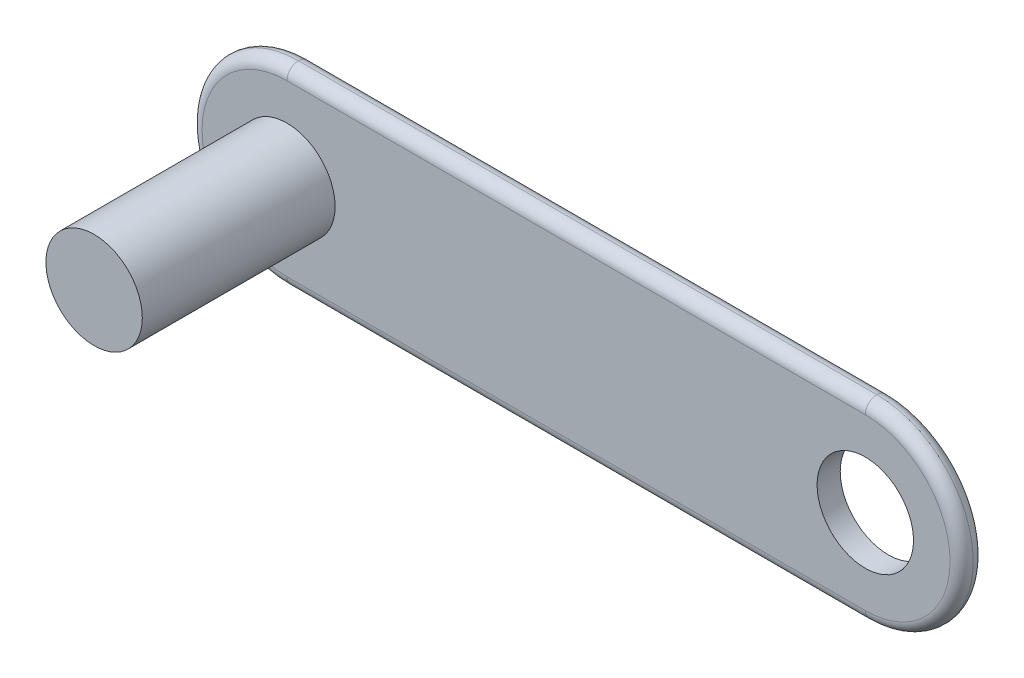
ISO-10303-21;
HEADER;
FILE_DESCRIPTION(('STEP AP214'),'2;1');
FILE_NAME('part.step','',(''),(''),'','','');
FILE_SCHEMA(('AUTOMOTIVE_DESIGN { 1 0 10303 214 1 1 1 1 }'));
ENDSEC;
DATA;
#1=APPLICATION_CONTEXT('core data for automotive mechanical design processes');
#2=APPLICATION_PROTOCOL_DEFINITION('international standard','automotive_design',2000,#1);
#3=PRODUCT_CONTEXT('',#1,'mechanical');
#4=PRODUCT('Part','Part','',(#3));
#5=PRODUCT_RELATED_PRODUCT_CATEGORY('part','',(#4));
#6=PRODUCT_DEFINITION_FORMATION('','',#4);
#7=PRODUCT_DEFINITION_CONTEXT('part definition',#1,'design');
#8=PRODUCT_DEFINITION('design','',#6,#7);
#9=PRODUCT_DEFINITION_SHAPE('','',#8);
#10=(LENGTH_UNIT() NAMED_UNIT(*) SI_UNIT(.MILLI.,.METRE.));
#11=(NAMED_UNIT(*) PLANE_ANGLE_UNIT() SI_UNIT($,.RADIAN.));
#12=(NAMED_UNIT(*) SI_UNIT($,.STERADIAN.) SOLID_ANGLE_UNIT());
#13=UNCERTAINTY_MEASURE_WITH_UNIT(LENGTH_MEASURE(1.E-05),#10,'distance_accuracy_value','');
#14=(GEOMETRIC_REPRESENTATION_CONTEXT(3) GLOBAL_UNCERTAINTY_ASSIGNED_CONTEXT((#13)) GLOBAL_UNIT_ASSIGNED_CONTEXT((#10,
#11,#12)) REPRESENTATION_CONTEXT('',''));
#15=CARTESIAN_POINT('',(0.,0.,0.));
#16=DIRECTION('',(0.,0.,1.));
#17=DIRECTION('',(1.,0.,0.));
#18=AXIS2_PLACEMENT_3D('',#15,#16,#17);
#19=CARTESIAN_POINT('',(0.,0.,1.524));
#20=DIRECTION('',(0.,0.,1.));
#21=DIRECTION('',(1.,0.,0.));
#22=AXIS2_PLACEMENT_3D('',#19,#20,#21);
#23=PLANE('',#22);
#24=DIRECTION('',(1.,0.,0.));
#25=VECTOR('',#24,1.);
#26=CARTESIAN_POINT('',(76.2,-11.176,1.524));
#27=LINE('',#26,#25);
#28=CARTESIAN_POINT('',(0.,-11.176,1.524));
#29=VERTEX_POINT('',#28);
#30=CARTESIAN_POINT('',(76.2,-11.176,1.524));
#31=VERTEX_POINT('',#30);
#32=EDGE_CURVE('E207',#29,#31,#27,.T.);
#33=ORIENTED_EDGE('',*,*,#32,.T.);
#34=CARTESIAN_POINT('',(76.2,0.,1.524));
#35=DIRECTION('',(0.,0.,1.));
#36=DIRECTION('',(1.,0.,0.));
#37=AXIS2_PLACEMENT_3D('',#34,#35,#36);
#38=CIRCLE('',#37,11.176);
#39=CARTESIAN_POINT('',(76.2,11.176,1.524));
#40=VERTEX_POINT('',#39);
#41=EDGE_CURVE('E111',#31,#40,#38,.T.);
#42=ORIENTED_EDGE('',*,*,#41,.T.);
#43=DIRECTION('',(-1.,0.,0.));
#44=VECTOR('',#43,1.);
#45=CARTESIAN_POINT('',(0.,11.176,1.524));
#46=LINE('',#45,#44);
#47=CARTESIAN_POINT('',(0.,11.176,1.524));
#48=VERTEX_POINT('',#47);
#49=EDGE_CURVE('E156',#40,#48,#46,.T.);
#50=ORIENTED_EDGE('',*,*,#49,.T.);
#51=CARTESIAN_POINT('',(0.,0.,1.524));
#52=DIRECTION('',(0.,0.,1.));
#53=DIRECTION('',(1.,0.,0.));
#54=AXIS2_PLACEMENT_3D('',#51,#52,#53);
#55=CIRCLE('',#54,11.176);
#56=EDGE_CURVE('E204',#48,#29,#55,.T.);
#57=ORIENTED_EDGE('',*,*,#56,.T.);
#58=EDGE_LOOP('',(#33,#42,#50,#57));
#59=FACE_BOUND('',#58,.T.);
#60=CARTESIAN_POINT('',(0.,0.,1.524));
#61=DIRECTION('',(0.,0.,1.));
#62=DIRECTION('',(1.,0.,0.));
#63=AXIS2_PLACEMENT_3D('',#60,#61,#62);
#64=CIRCLE('',#63,6.35);
#65=CARTESIAN_POINT('',(6.35,0.,1.524));
#66=VERTEX_POINT('',#65);
#67=EDGE_CURVE('E182',#66,#66,#64,.T.);
#68=ORIENTED_EDGE('',*,*,#67,.F.);
#69=EDGE_LOOP('',(#68));
#70=FACE_BOUND('',#69,.T.);
#71=CARTESIAN_POINT('',(76.2,0.,1.524));
#72=DIRECTION('',(0.,0.,1.));
#73=DIRECTION('',(1.,0.,0.));
#74=AXIS2_PLACEMENT_3D('',#71,#72,#73);
#75=CIRCLE('',#74,6.35);
#76=CARTESIAN_POINT('',(69.85,0.,1.524));
#77=VERTEX_POINT('',#76);
#78=EDGE_CURVE('E198',#77,#77,#75,.F.);
#79=ORIENTED_EDGE('',*,*,#78,.T.);
#80=EDGE_LOOP('',(#79));
#81=FACE_BOUND('',#80,.T.);
#82=ADVANCED_FACE('F39',(#59,#70,#81),#23,.T.);
#83=CARTESIAN_POINT('',(0.,0.,-1.524));
#84=DIRECTION('',(0.,0.,1.));
#85=DIRECTION('',(1.,0.,0.));
#86=AXIS2_PLACEMENT_3D('',#83,#84,#85);
#87=PLANE('',#86);
#88=DIRECTION('',(-1.,0.,0.));
#89=VECTOR('',#88,1.);
#90=CARTESIAN_POINT('',(0.,11.176,-1.524));
#91=LINE('',#90,#89);
#92=CARTESIAN_POINT('',(0.,11.176,-1.524));
#93=VERTEX_POINT('',#92);
#94=CARTESIAN_POINT('',(76.2,11.176,-1.524));
#95=VERTEX_POINT('',#94);
#96=EDGE_CURVE('E104',#93,#95,#91,.F.);
#97=ORIENTED_EDGE('',*,*,#96,.T.);
#98=CARTESIAN_POINT('',(76.2,0.,-1.524));
#99=DIRECTION('',(0.,0.,1.));
#100=DIRECTION('',(1.,0.,0.));
#101=AXIS2_PLACEMENT_3D('',#98,#99,#100);
#102=CIRCLE('',#101,11.176);
#103=CARTESIAN_POINT('',(76.2,-11.176,-1.524));
#104=VERTEX_POINT('',#103);
#105=EDGE_CURVE('E11',#95,#104,#102,.F.);
#106=ORIENTED_EDGE('',*,*,#105,.T.);
#107=DIRECTION('',(1.,0.,0.));
#108=VECTOR('',#107,1.);
#109=CARTESIAN_POINT('',(0.,-11.176,-1.524));
#110=LINE('',#109,#108);
#111=CARTESIAN_POINT('',(0.,-11.176,-1.524));
#112=VERTEX_POINT('',#111);
#113=EDGE_CURVE('E50',#104,#112,#110,.F.);
#114=ORIENTED_EDGE('',*,*,#113,.T.);
#115=CARTESIAN_POINT('',(0.,0.,-1.524));
#116=DIRECTION('',(0.,0.,1.));
#117=DIRECTION('',(1.,0.,0.));
#118=AXIS2_PLACEMENT_3D('',#115,#116,#117);
#119=CIRCLE('',#118,11.176);
#120=EDGE_CURVE('E108',#112,#93,#119,.F.);
#121=ORIENTED_EDGE('',*,*,#120,.T.);
#122=EDGE_LOOP('',(#97,#106,#114,#121));
#123=FACE_BOUND('',#122,.T.);
#124=CARTESIAN_POINT('',(76.2,0.,-1.524));
#125=DIRECTION('',(0.,0.,1.));
#126=DIRECTION('',(1.,0.,0.));
#127=AXIS2_PLACEMENT_3D('',#124,#125,#126);
#128=CIRCLE('',#127,6.35);
#129=CARTESIAN_POINT('',(69.85,0.,-1.524));
#130=VERTEX_POINT('',#129);
#131=EDGE_CURVE('E192',#130,#130,#128,.T.);
#132=ORIENTED_EDGE('',*,*,#131,.T.);
#133=EDGE_LOOP('',(#132));
#134=FACE_BOUND('',#133,.T.);
#135=ADVANCED_FACE('F106',(#123,#134),#87,.F.);
#136=CARTESIAN_POINT('',(76.2,0.,3.048));
#137=DIRECTION('',(0.,0.,-1.));
#138=DIRECTION('',(-1.,0.,0.));
#139=AXIS2_PLACEMENT_3D('',#136,#137,#138);
#140=CYLINDRICAL_SURFACE('',#139,6.35);
#141=CARTESIAN_POINT('',(69.85,0.,1.524));
#142=CARTESIAN_POINT('',(69.85,0.,1.49225));
#143=CARTESIAN_POINT('',(69.85,0.,1.4605));
#144=CARTESIAN_POINT('',(69.85,0.,1.397));
#145=CARTESIAN_POINT('',(69.85,0.,1.36525));
#146=CARTESIAN_POINT('',(69.85,0.,1.30175));
#147=CARTESIAN_POINT('',(69.85,0.,1.27));
#148=CARTESIAN_POINT('',(69.85,0.,1.2065));
#149=CARTESIAN_POINT('',(69.85,0.,1.17475));
#150=CARTESIAN_POINT('',(69.85,0.,1.11125));
#151=CARTESIAN_POINT('',(69.85,0.,1.0795));
#152=CARTESIAN_POINT('',(69.85,0.,1.016));
#153=CARTESIAN_POINT('',(69.85,0.,0.98425));
#154=CARTESIAN_POINT('',(69.85,0.,0.92075));
#155=CARTESIAN_POINT('',(69.85,0.,0.889));
#156=CARTESIAN_POINT('',(69.85,0.,0.8255));
#157=CARTESIAN_POINT('',(69.85,0.,0.79375));
#158=CARTESIAN_POINT('',(69.85,0.,0.73025));
#159=CARTESIAN_POINT('',(69.85,0.,0.6985));
#160=CARTESIAN_POINT('',(69.85,0.,0.635));
#161=CARTESIAN_POINT('',(69.85,0.,0.60325));
#162=CARTESIAN_POINT('',(69.85,0.,0.53975));
#163=CARTESIAN_POINT('',(69.85,0.,0.508));
#164=CARTESIAN_POINT('',(69.85,0.,0.4445));
#165=CARTESIAN_POINT('',(69.85,0.,0.41275));
#166=CARTESIAN_POINT('',(69.85,0.,0.34925));
#167=CARTESIAN_POINT('',(69.85,0.,0.3175));
#168=CARTESIAN_POINT('',(69.85,0.,0.254));
#169=CARTESIAN_POINT('',(69.85,0.,0.22225));
#170=CARTESIAN_POINT('',(69.85,0.,0.15875));
#171=CARTESIAN_POINT('',(69.85,0.,0.127));
#172=CARTESIAN_POINT('',(69.85,0.,0.0634999999999998));
#173=CARTESIAN_POINT('',(69.85,0.,0.0317499999999997));
#174=CARTESIAN_POINT('',(69.85,0.,-0.0317500000000005));
#175=CARTESIAN_POINT('',(69.85,0.,-0.0635000000000006));
#176=CARTESIAN_POINT('',(69.85,0.,-0.127000000000001));
#177=CARTESIAN_POINT('',(69.85,0.,-0.158750000000001));
#178=CARTESIAN_POINT('',(69.85,0.,-0.222250000000001));
#179=CARTESIAN_POINT('',(69.85,0.,-0.254000000000001));
#180=CARTESIAN_POINT('',(69.85,0.,-0.317500000000001));
#181=CARTESIAN_POINT('',(69.85,0.,-0.349250000000001));
#182=CARTESIAN_POINT('',(69.85,0.,-0.412750000000001));
#183=CARTESIAN_POINT('',(69.85,0.,-0.444500000000001));
#184=CARTESIAN_POINT('',(69.85,0.,-0.508000000000001));
#185=CARTESIAN_POINT('',(69.85,0.,-0.539750000000001));
#186=CARTESIAN_POINT('',(69.85,0.,-0.603250000000001));
#187=CARTESIAN_POINT('',(69.85,0.,-0.635000000000001));
#188=CARTESIAN_POINT('',(69.85,0.,-0.698500000000001));
#189=CARTESIAN_POINT('',(69.85,0.,-0.730250000000001));
#190=CARTESIAN_POINT('',(69.85,0.,-0.793750000000001));
#191=CARTESIAN_POINT('',(69.85,0.,-0.825500000000001));
#192=CARTESIAN_POINT('',(69.85,0.,-0.889));
#193=CARTESIAN_POINT('',(69.85,0.,-0.92075));
#194=CARTESIAN_POINT('',(69.85,0.,-0.98425));
#195=CARTESIAN_POINT('',(69.85,0.,-1.016));
#196=CARTESIAN_POINT('',(69.85,0.,-1.0795));
#197=CARTESIAN_POINT('',(69.85,0.,-1.11125));
#198=CARTESIAN_POINT('',(69.85,0.,-1.17475));
#199=CARTESIAN_POINT('',(69.85,0.,-1.2065));
#200=CARTESIAN_POINT('',(69.85,0.,-1.27));
#201=CARTESIAN_POINT('',(69.85,0.,-1.30175));
#202=CARTESIAN_POINT('',(69.85,0.,-1.36525));
#203=CARTESIAN_POINT('',(69.85,0.,-1.397));
#204=CARTESIAN_POINT('',(69.85,0.,-1.4605));
#205=CARTESIAN_POINT('',(69.85,0.,-1.49225));
#206=CARTESIAN_POINT('',(69.85,0.,-1.524));
#207=B_SPLINE_CURVE_WITH_KNOTS('',3,(#141,#142,#143,#144,#145,#146,#147,#148,#149,#150,#151,
#152,#153,#154,#155,#156,#157,#158,#159,#160,#161,#162,#163,#164,#165,#166,#167,#168,#169,#170,
#171,#172,#173,#174,#175,#176,#177,#178,#179,#180,#181,#182,#183,#184,#185,#186,#187,#188,#189,
#190,#191,#192,#193,#194,#195,#196,#197,#198,#199,#200,#201,#202,#203,#204,#205,#206),
.UNSPECIFIED.,.F.,.F.,(4,2,2,2,2,2,2,2,2,2,2,2,2,2,2,2,2,2,2,2,2,2,2,2,2,2,2,2,2,2,2,2,4),(0.,
0.0952500000000001,0.1905,0.28575,0.381,0.47625,0.5715,0.66675,0.762,0.85725,0.9525,1.04775,
1.143,1.23825,1.3335,1.42875,1.524,1.61925,1.7145,1.80975,1.905,2.00025,2.0955,2.19075,2.286,
2.38125,2.4765,2.57175,2.667,2.76225,2.8575,2.95275,3.048),.UNSPECIFIED.);
#208=EDGE_CURVE('BSEAM140',#77,#130,#207,.T.);
#209=ORIENTED_EDGE('',*,*,#78,.F.);
#210=ORIENTED_EDGE('',*,*,#131,.F.);
#211=ORIENTED_EDGE('',*,*,#208,.T.);
#212=ORIENTED_EDGE('',*,*,#208,.F.);
#213=EDGE_LOOP('',(#209,#211,#210,#212));
#214=FACE_BOUND('',#213,.T.);
#215=ADVANCED_FACE('F140',(#214),#140,.F.);
#216=CARTESIAN_POINT('',(0.,0.,26.924));
#217=DIRECTION('',(0.,0.,-1.));
#218=DIRECTION('',(-1.,0.,0.));
#219=AXIS2_PLACEMENT_3D('',#216,#217,#218);
#220=CYLINDRICAL_SURFACE('',#219,6.35);
#221=CARTESIAN_POINT('',(0.,0.,26.924));
#222=DIRECTION('',(0.,0.,1.));
#223=DIRECTION('',(1.,0.,0.));
#224=AXIS2_PLACEMENT_3D('',#221,#222,#223);
#225=CIRCLE('',#224,6.35);
#226=CARTESIAN_POINT('',(6.35,0.,26.924));
#227=VERTEX_POINT('',#226);
#228=EDGE_CURVE('E186',#227,#227,#225,.T.);
#229=ORIENTED_EDGE('',*,*,#228,.F.);
#230=EDGE_LOOP('',(#229));
#231=FACE_BOUND('',#230,.T.);
#232=ORIENTED_EDGE('',*,*,#67,.T.);
#233=EDGE_LOOP('',(#232));
#234=FACE_BOUND('',#233,.T.);
#235=ADVANCED_FACE('F231',(#231,#234),#220,.T.);
#236=CARTESIAN_POINT('',(0.,0.,26.924));
#237=DIRECTION('',(0.,0.,1.));
#238=DIRECTION('',(1.,0.,0.));
#239=AXIS2_PLACEMENT_3D('',#236,#237,#238);
#240=PLANE('',#239);
#241=ORIENTED_EDGE('',*,*,#228,.T.);
#242=EDGE_LOOP('',(#241));
#243=FACE_BOUND('',#242,.T.);
#244=ADVANCED_FACE('F226',(#243),#240,.T.);
#245=CARTESIAN_POINT('',(0.,0.,0.));
#246=DIRECTION('',(0.,0.,1.));
#247=DIRECTION('',(1.,0.,0.));
#248=AXIS2_PLACEMENT_3D('',#245,#246,#247);
#249=TOROIDAL_SURFACE('',#248,11.176,1.524);
#250=CARTESIAN_POINT('',(0.,11.176,0.));
#251=DIRECTION('',(1.,0.,0.));
#252=DIRECTION('',(0.,0.,-1.));
#253=AXIS2_PLACEMENT_3D('',#250,#251,#252);
#254=CIRCLE('',#253,1.524);
#255=CARTESIAN_POINT('',(0.,12.7,0.));
#256=VERTEX_POINT('',#255);
#257=EDGE_CURVE('E119',#93,#256,#254,.T.);
#258=ORIENTED_EDGE('',*,*,#257,.F.);
#259=ORIENTED_EDGE('',*,*,#120,.F.);
#260=CARTESIAN_POINT('',(0.,-11.176,0.));
#261=DIRECTION('',(1.,0.,0.));
#262=DIRECTION('',(0.,0.,-1.));
#263=AXIS2_PLACEMENT_3D('',#260,#261,#262);
#264=CIRCLE('',#263,1.524);
#265=CARTESIAN_POINT('',(0.,-12.7,0.));
#266=VERTEX_POINT('',#265);
#267=EDGE_CURVE('E43',#266,#112,#264,.T.);
#268=ORIENTED_EDGE('',*,*,#267,.F.);
#269=CARTESIAN_POINT('',(0.,0.,0.));
#270=DIRECTION('',(0.,0.,1.));
#271=DIRECTION('',(1.,0.,0.));
#272=AXIS2_PLACEMENT_3D('',#269,#270,#271);
#273=CIRCLE('',#272,12.7);
#274=EDGE_CURVE('E76',#256,#266,#273,.T.);
#275=ORIENTED_EDGE('',*,*,#274,.F.);
#276=EDGE_LOOP('',(#258,#259,#268,#275));
#277=FACE_BOUND('',#276,.T.);
#278=ADVANCED_FACE('F41',(#277),#249,.T.);
#279=CARTESIAN_POINT('',(0.,-11.176,0.));
#280=DIRECTION('',(1.,0.,0.));
#281=DIRECTION('',(0.,0.,-1.));
#282=AXIS2_PLACEMENT_3D('',#279,#280,#281);
#283=CYLINDRICAL_SURFACE('',#282,1.524);
#284=ORIENTED_EDGE('',*,*,#267,.T.);
#285=ORIENTED_EDGE('',*,*,#113,.F.);
#286=CARTESIAN_POINT('',(76.2,-11.176,0.));
#287=DIRECTION('',(1.,0.,0.));
#288=DIRECTION('',(0.,0.,-1.));
#289=AXIS2_PLACEMENT_3D('',#286,#287,#288);
#290=CIRCLE('',#289,1.524);
#291=CARTESIAN_POINT('',(76.2,-12.7,0.));
#292=VERTEX_POINT('',#291);
#293=EDGE_CURVE('E59',#292,#104,#290,.T.);
#294=ORIENTED_EDGE('',*,*,#293,.F.);
#295=DIRECTION('',(1.,0.,0.));
#296=VECTOR('',#295,1.);
#297=CARTESIAN_POINT('',(0.,-12.7,0.));
#298=LINE('',#297,#296);
#299=EDGE_CURVE('E166',#266,#292,#298,.T.);
#300=ORIENTED_EDGE('',*,*,#299,.F.);
#301=EDGE_LOOP('',(#284,#285,#294,#300));
#302=FACE_BOUND('',#301,.T.);
#303=ADVANCED_FACE('F224',(#302),#283,.T.);
#304=CARTESIAN_POINT('',(0.,0.,0.));
#305=DIRECTION('',(0.,0.,1.));
#306=DIRECTION('',(1.,0.,0.));
#307=AXIS2_PLACEMENT_3D('',#304,#305,#306);
#308=TOROIDAL_SURFACE('',#307,11.176,1.524);
#309=CARTESIAN_POINT('',(0.,11.176,0.));
#310=DIRECTION('',(1.,0.,0.));
#311=DIRECTION('',(0.,0.,-1.));
#312=AXIS2_PLACEMENT_3D('',#309,#310,#311);
#313=CIRCLE('',#312,1.524);
#314=EDGE_CURVE('E155',#256,#48,#313,.T.);
#315=ORIENTED_EDGE('',*,*,#314,.F.);
#316=ORIENTED_EDGE('',*,*,#274,.T.);
#317=CARTESIAN_POINT('',(0.,-11.176,0.));
#318=DIRECTION('',(1.,0.,0.));
#319=DIRECTION('',(0.,0.,-1.));
#320=AXIS2_PLACEMENT_3D('',#317,#318,#319);
#321=CIRCLE('',#320,1.524);
#322=EDGE_CURVE('E161',#29,#266,#321,.T.);
#323=ORIENTED_EDGE('',*,*,#322,.F.);
#324=ORIENTED_EDGE('',*,*,#56,.F.);
#325=EDGE_LOOP('',(#315,#316,#323,#324));
#326=FACE_BOUND('',#325,.T.);
#327=ADVANCED_FACE('F132',(#326),#308,.T.);
#328=CARTESIAN_POINT('',(0.,11.176,0.));
#329=DIRECTION('',(-1.,0.,0.));
#330=DIRECTION('',(0.,0.,1.));
#331=AXIS2_PLACEMENT_3D('',#328,#329,#330);
#332=CYLINDRICAL_SURFACE('',#331,1.524);
#333=CARTESIAN_POINT('',(76.2,11.176,0.));
#334=DIRECTION('',(1.,0.,0.));
#335=DIRECTION('',(0.,0.,-1.));
#336=AXIS2_PLACEMENT_3D('',#333,#334,#335);
#337=CIRCLE('',#336,1.524);
#338=CARTESIAN_POINT('',(76.2,12.7,0.));
#339=VERTEX_POINT('',#338);
#340=EDGE_CURVE('E114',#95,#339,#337,.T.);
#341=ORIENTED_EDGE('',*,*,#340,.F.);
#342=ORIENTED_EDGE('',*,*,#96,.F.);
#343=ORIENTED_EDGE('',*,*,#257,.T.);
#344=DIRECTION('',(-1.,0.,0.));
#345=VECTOR('',#344,1.);
#346=CARTESIAN_POINT('',(0.,12.7,0.));
#347=LINE('',#346,#345);
#348=EDGE_CURVE('E117',#339,#256,#347,.T.);
#349=ORIENTED_EDGE('',*,*,#348,.F.);
#350=EDGE_LOOP('',(#341,#342,#343,#349));
#351=FACE_BOUND('',#350,.T.);
#352=ADVANCED_FACE('F115',(#351),#332,.T.);
#353=CARTESIAN_POINT('',(76.2,0.,0.));
#354=DIRECTION('',(0.,0.,1.));
#355=DIRECTION('',(1.,0.,0.));
#356=AXIS2_PLACEMENT_3D('',#353,#354,#355);
#357=TOROIDAL_SURFACE('',#356,11.176,1.524);
#358=ORIENTED_EDGE('',*,*,#105,.F.);
#359=ORIENTED_EDGE('',*,*,#340,.T.);
#360=CARTESIAN_POINT('',(76.2,0.,0.));
#361=DIRECTION('',(0.,0.,1.));
#362=DIRECTION('',(1.,0.,0.));
#363=AXIS2_PLACEMENT_3D('',#360,#361,#362);
#364=CIRCLE('',#363,12.7);
#365=EDGE_CURVE('E168',#292,#339,#364,.T.);
#366=ORIENTED_EDGE('',*,*,#365,.F.);
#367=ORIENTED_EDGE('',*,*,#293,.T.);
#368=EDGE_LOOP('',(#358,#359,#366,#367));
#369=FACE_BOUND('',#368,.T.);
#370=ADVANCED_FACE('F121',(#369),#357,.T.);
#371=CARTESIAN_POINT('',(0.,-11.176,0.));
#372=DIRECTION('',(-1.,0.,0.));
#373=DIRECTION('',(0.,0.,1.));
#374=AXIS2_PLACEMENT_3D('',#371,#372,#373);
#375=CYLINDRICAL_SURFACE('',#374,1.524);
#376=ORIENTED_EDGE('',*,*,#322,.T.);
#377=ORIENTED_EDGE('',*,*,#299,.T.);
#378=CARTESIAN_POINT('',(76.2,-11.176,0.));
#379=DIRECTION('',(1.,0.,0.));
#380=DIRECTION('',(0.,0.,-1.));
#381=AXIS2_PLACEMENT_3D('',#378,#379,#380);
#382=CIRCLE('',#381,1.524);
#383=EDGE_CURVE('E218',#31,#292,#382,.T.);
#384=ORIENTED_EDGE('',*,*,#383,.F.);
#385=ORIENTED_EDGE('',*,*,#32,.F.);
#386=EDGE_LOOP('',(#376,#377,#384,#385));
#387=FACE_BOUND('',#386,.T.);
#388=ADVANCED_FACE('F123',(#387),#375,.T.);
#389=CARTESIAN_POINT('',(0.,11.176,0.));
#390=DIRECTION('',(1.,0.,0.));
#391=DIRECTION('',(0.,0.,-1.));
#392=AXIS2_PLACEMENT_3D('',#389,#390,#391);
#393=CYLINDRICAL_SURFACE('',#392,1.524);
#394=ORIENTED_EDGE('',*,*,#314,.T.);
#395=ORIENTED_EDGE('',*,*,#49,.F.);
#396=CARTESIAN_POINT('',(76.2,11.176,0.));
#397=DIRECTION('',(1.,0.,0.));
#398=DIRECTION('',(0.,0.,-1.));
#399=AXIS2_PLACEMENT_3D('',#396,#397,#398);
#400=CIRCLE('',#399,1.524);
#401=EDGE_CURVE('E88',#339,#40,#400,.T.);
#402=ORIENTED_EDGE('',*,*,#401,.F.);
#403=ORIENTED_EDGE('',*,*,#348,.T.);
#404=EDGE_LOOP('',(#394,#395,#402,#403));
#405=FACE_BOUND('',#404,.T.);
#406=ADVANCED_FACE('F129',(#405),#393,.T.);
#407=CARTESIAN_POINT('',(76.2,0.,0.));
#408=DIRECTION('',(0.,0.,1.));
#409=DIRECTION('',(1.,0.,0.));
#410=AXIS2_PLACEMENT_3D('',#407,#408,#409);
#411=TOROIDAL_SURFACE('',#410,11.176,1.524);
#412=ORIENTED_EDGE('',*,*,#383,.T.);
#413=ORIENTED_EDGE('',*,*,#365,.T.);
#414=ORIENTED_EDGE('',*,*,#401,.T.);
#415=ORIENTED_EDGE('',*,*,#41,.F.);
#416=EDGE_LOOP('',(#412,#413,#414,#415));
#417=FACE_BOUND('',#416,.T.);
#418=ADVANCED_FACE('F146',(#417),#411,.T.);
#419=CLOSED_SHELL('',(#82,#135,#215,#235,#244,#278,#303,#327,#352,#370,#388,#406,#418));
#420=MANIFOLD_SOLID_BREP('B2',#419);
#421=ADVANCED_BREP_SHAPE_REPRESENTATION('',(#18,#420),#14);
#422=SHAPE_DEFINITION_REPRESENTATION(#9,#421);
ENDSEC;
END-ISO-10303-21;
